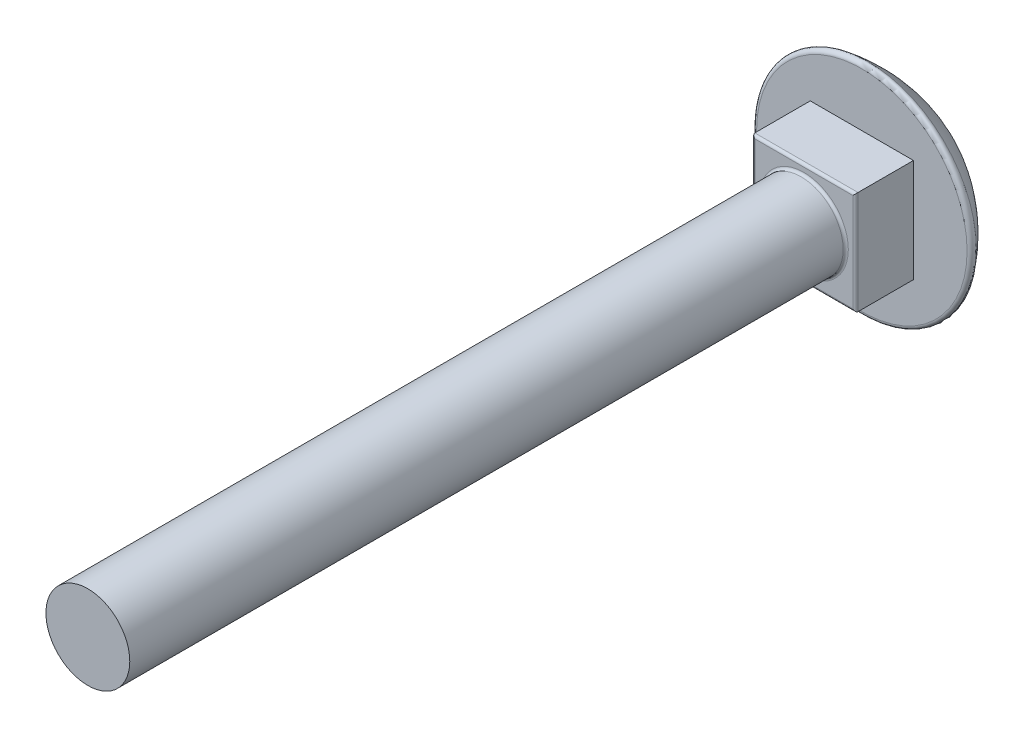
ISO-10303-21;
HEADER;
FILE_DESCRIPTION(('STEP AP214'),'2;1');
FILE_NAME('part.step','',(''),(''),'','','');
FILE_SCHEMA(('AUTOMOTIVE_DESIGN { 1 0 10303 214 1 1 1 1 }'));
ENDSEC;
DATA;
#1=APPLICATION_CONTEXT('core data for automotive mechanical design processes');
#2=APPLICATION_PROTOCOL_DEFINITION('international standard','automotive_design',2000,#1);
#3=PRODUCT_CONTEXT('',#1,'mechanical');
#4=PRODUCT('Part','Part','',(#3));
#5=PRODUCT_RELATED_PRODUCT_CATEGORY('part','',(#4));
#6=PRODUCT_DEFINITION_FORMATION('','',#4);
#7=PRODUCT_DEFINITION_CONTEXT('part definition',#1,'design');
#8=PRODUCT_DEFINITION('design','',#6,#7);
#9=PRODUCT_DEFINITION_SHAPE('','',#8);
#10=(LENGTH_UNIT() NAMED_UNIT(*) SI_UNIT(.MILLI.,.METRE.));
#11=(NAMED_UNIT(*) PLANE_ANGLE_UNIT() SI_UNIT($,.RADIAN.));
#12=(NAMED_UNIT(*) SI_UNIT($,.STERADIAN.) SOLID_ANGLE_UNIT());
#13=UNCERTAINTY_MEASURE_WITH_UNIT(LENGTH_MEASURE(1.E-05),#10,'distance_accuracy_value','');
#14=(GEOMETRIC_REPRESENTATION_CONTEXT(3) GLOBAL_UNCERTAINTY_ASSIGNED_CONTEXT((#13)) GLOBAL_UNIT_ASSIGNED_CONTEXT((#10,
#11,#12)) REPRESENTATION_CONTEXT('',''));
#15=CARTESIAN_POINT('',(0.,0.,0.));
#16=DIRECTION('',(0.,0.,1.));
#17=DIRECTION('',(1.,0.,0.));
#18=AXIS2_PLACEMENT_3D('',#15,#16,#17);
#19=CARTESIAN_POINT('',(0.,0.,0.));
#20=DIRECTION('',(0.,0.,1.));
#21=DIRECTION('',(1.,0.,0.));
#22=AXIS2_PLACEMENT_3D('',#19,#20,#21);
#23=PLANE('',#22);
#24=CARTESIAN_POINT('',(-3.25,0.,0.));
#25=DIRECTION('',(0.,0.,1.));
#26=DIRECTION('',(1.,0.,0.));
#27=AXIS2_PLACEMENT_3D('',#24,#25,#26);
#28=CIRCLE('',#27,3.25);
#29=CARTESIAN_POINT('',(0.,0.,0.));
#30=VERTEX_POINT('',#29);
#31=EDGE_CURVE('E115',#30,#30,#28,.T.);
#32=ORIENTED_EDGE('',*,*,#31,.T.);
#33=EDGE_LOOP('',(#32));
#34=FACE_BOUND('',#33,.T.);
#35=ADVANCED_FACE('F50',(#34),#23,.T.);
#36=CARTESIAN_POINT('',(-3.25,0.,0.));
#37=DIRECTION('',(0.,0.,1.));
#38=DIRECTION('',(1.,0.,0.));
#39=AXIS2_PLACEMENT_3D('',#36,#37,#38);
#40=CYLINDRICAL_SURFACE('',#39,3.25);
#41=CARTESIAN_POINT('',(-3.25,0.,-55.3));
#42=DIRECTION('',(0.,0.,1.));
#43=DIRECTION('',(1.,0.,0.));
#44=AXIS2_PLACEMENT_3D('',#41,#42,#43);
#45=CIRCLE('',#44,3.25);
#46=CARTESIAN_POINT('',(0.,0.,-55.3));
#47=VERTEX_POINT('',#46);
#48=EDGE_CURVE('E179',#47,#47,#45,.T.);
#49=ORIENTED_EDGE('',*,*,#48,.T.);
#50=EDGE_LOOP('',(#49));
#51=FACE_BOUND('',#50,.T.);
#52=ORIENTED_EDGE('',*,*,#31,.F.);
#53=EDGE_LOOP('',(#52));
#54=FACE_BOUND('',#53,.T.);
#55=ADVANCED_FACE('F211',(#51,#54),#40,.T.);
#56=CARTESIAN_POINT('',(0.750000000000001,4.,-55.5));
#57=DIRECTION('',(-1.,0.,0.));
#58=DIRECTION('',(0.,-1.,0.));
#59=AXIS2_PLACEMENT_3D('',#56,#57,#58);
#60=PLANE('',#59);
#61=DIRECTION('',(0.,0.,-1.));
#62=VECTOR('',#61,1.);
#63=CARTESIAN_POINT('',(0.750000000000001,4.,-55.5));
#64=LINE('',#63,#62);
#65=CARTESIAN_POINT('',(0.750000000000001,4.,-55.7));
#66=VERTEX_POINT('',#65);
#67=CARTESIAN_POINT('',(0.750000000000001,4.,-60.));
#68=VERTEX_POINT('',#67);
#69=EDGE_CURVE('E106',#66,#68,#64,.T.);
#70=ORIENTED_EDGE('',*,*,#69,.F.);
#71=DIRECTION('',(0.,1.,0.));
#72=VECTOR('',#71,1.);
#73=CARTESIAN_POINT('',(0.750000000000002,-4.,-55.7));
#74=LINE('',#73,#72);
#75=CARTESIAN_POINT('',(0.750000000000002,-4.,-55.7));
#76=VERTEX_POINT('',#75);
#77=EDGE_CURVE('E176',#66,#76,#74,.F.);
#78=ORIENTED_EDGE('',*,*,#77,.T.);
#79=DIRECTION('',(0.,0.,-1.));
#80=VECTOR('',#79,1.);
#81=CARTESIAN_POINT('',(0.750000000000002,-4.,-55.5));
#82=LINE('',#81,#80);
#83=CARTESIAN_POINT('',(0.750000000000002,-4.,-60.));
#84=VERTEX_POINT('',#83);
#85=EDGE_CURVE('E122',#76,#84,#82,.T.);
#86=ORIENTED_EDGE('',*,*,#85,.T.);
#87=DIRECTION('',(0.,1.,0.));
#88=VECTOR('',#87,1.);
#89=CARTESIAN_POINT('',(0.750000000000001,4.,-60.));
#90=LINE('',#89,#88);
#91=EDGE_CURVE('E119',#84,#68,#90,.T.);
#92=ORIENTED_EDGE('',*,*,#91,.T.);
#93=EDGE_LOOP('',(#70,#78,#86,#92));
#94=FACE_BOUND('',#93,.T.);
#95=ADVANCED_FACE('F120',(#94),#60,.F.);
#96=CARTESIAN_POINT('',(-7.25,4.,-55.5));
#97=DIRECTION('',(0.,-1.,0.));
#98=DIRECTION('',(0.,0.,-1.));
#99=AXIS2_PLACEMENT_3D('',#96,#97,#98);
#100=PLANE('',#99);
#101=DIRECTION('',(0.,0.,-1.));
#102=VECTOR('',#101,1.);
#103=CARTESIAN_POINT('',(-7.25,4.,-55.5));
#104=LINE('',#103,#102);
#105=CARTESIAN_POINT('',(-7.25,4.,-55.7));
#106=VERTEX_POINT('',#105);
#107=CARTESIAN_POINT('',(-7.25,4.,-60.));
#108=VERTEX_POINT('',#107);
#109=EDGE_CURVE('E116',#106,#108,#104,.T.);
#110=ORIENTED_EDGE('',*,*,#109,.F.);
#111=DIRECTION('',(-1.,0.,0.));
#112=VECTOR('',#111,1.);
#113=CARTESIAN_POINT('',(0.750000000000001,4.,-55.7));
#114=LINE('',#113,#112);
#115=EDGE_CURVE('E66',#106,#66,#114,.F.);
#116=ORIENTED_EDGE('',*,*,#115,.T.);
#117=ORIENTED_EDGE('',*,*,#69,.T.);
#118=DIRECTION('',(-1.,0.,0.));
#119=VECTOR('',#118,1.);
#120=CARTESIAN_POINT('',(-7.25,4.,-60.));
#121=LINE('',#120,#119);
#122=EDGE_CURVE('E110',#68,#108,#121,.T.);
#123=ORIENTED_EDGE('',*,*,#122,.T.);
#124=EDGE_LOOP('',(#110,#116,#117,#123));
#125=FACE_BOUND('',#124,.T.);
#126=ADVANCED_FACE('F108',(#125),#100,.F.);
#127=CARTESIAN_POINT('',(-7.25,4.,-55.5));
#128=DIRECTION('',(1.,0.,0.));
#129=DIRECTION('',(0.,1.,0.));
#130=AXIS2_PLACEMENT_3D('',#127,#128,#129);
#131=PLANE('',#130);
#132=DIRECTION('',(0.,0.,-1.));
#133=VECTOR('',#132,1.);
#134=CARTESIAN_POINT('',(-7.25,-4.,-55.5));
#135=LINE('',#134,#133);
#136=CARTESIAN_POINT('',(-7.25,-4.,-55.7));
#137=VERTEX_POINT('',#136);
#138=CARTESIAN_POINT('',(-7.25,-4.,-60.));
#139=VERTEX_POINT('',#138);
#140=EDGE_CURVE('E143',#137,#139,#135,.T.);
#141=ORIENTED_EDGE('',*,*,#140,.F.);
#142=DIRECTION('',(0.,-1.,0.));
#143=VECTOR('',#142,1.);
#144=CARTESIAN_POINT('',(-7.25,4.,-55.7));
#145=LINE('',#144,#143);
#146=EDGE_CURVE('E74',#137,#106,#145,.F.);
#147=ORIENTED_EDGE('',*,*,#146,.T.);
#148=ORIENTED_EDGE('',*,*,#109,.T.);
#149=DIRECTION('',(0.,-1.,0.));
#150=VECTOR('',#149,1.);
#151=CARTESIAN_POINT('',(-7.25,4.,-60.));
#152=LINE('',#151,#150);
#153=EDGE_CURVE('E131',#108,#139,#152,.T.);
#154=ORIENTED_EDGE('',*,*,#153,.T.);
#155=EDGE_LOOP('',(#141,#147,#148,#154));
#156=FACE_BOUND('',#155,.T.);
#157=ADVANCED_FACE('F263',(#156),#131,.F.);
#158=CARTESIAN_POINT('',(-7.25,-4.,-55.5));
#159=DIRECTION('',(0.,1.,0.));
#160=DIRECTION('',(0.,0.,1.));
#161=AXIS2_PLACEMENT_3D('',#158,#159,#160);
#162=PLANE('',#161);
#163=ORIENTED_EDGE('',*,*,#85,.F.);
#164=DIRECTION('',(1.,0.,0.));
#165=VECTOR('',#164,1.);
#166=CARTESIAN_POINT('',(-7.25,-4.,-55.7));
#167=LINE('',#166,#165);
#168=EDGE_CURVE('E168',#76,#137,#167,.F.);
#169=ORIENTED_EDGE('',*,*,#168,.T.);
#170=ORIENTED_EDGE('',*,*,#140,.T.);
#171=DIRECTION('',(1.,0.,0.));
#172=VECTOR('',#171,1.);
#173=CARTESIAN_POINT('',(-7.25,-4.,-60.));
#174=LINE('',#173,#172);
#175=EDGE_CURVE('E136',#139,#84,#174,.T.);
#176=ORIENTED_EDGE('',*,*,#175,.T.);
#177=EDGE_LOOP('',(#163,#169,#170,#176));
#178=FACE_BOUND('',#177,.T.);
#179=ADVANCED_FACE('F246',(#178),#162,.F.);
#180=CARTESIAN_POINT('',(0.,0.,-55.5));
#181=DIRECTION('',(0.,0.,1.));
#182=DIRECTION('',(1.,0.,0.));
#183=AXIS2_PLACEMENT_3D('',#180,#181,#182);
#184=PLANE('',#183);
#185=DIRECTION('',(0.,-1.,0.));
#186=VECTOR('',#185,1.);
#187=CARTESIAN_POINT('',(-7.05,-4.,-55.5));
#188=LINE('',#187,#186);
#189=CARTESIAN_POINT('',(-7.05,3.8,-55.5));
#190=VERTEX_POINT('',#189);
#191=CARTESIAN_POINT('',(-7.05,-3.8,-55.5));
#192=VERTEX_POINT('',#191);
#193=EDGE_CURVE('E161',#190,#192,#188,.T.);
#194=ORIENTED_EDGE('',*,*,#193,.T.);
#195=DIRECTION('',(1.,0.,0.));
#196=VECTOR('',#195,1.);
#197=CARTESIAN_POINT('',(0.750000000000002,-3.8,-55.5));
#198=LINE('',#197,#196);
#199=CARTESIAN_POINT('',(0.550000000000002,-3.8,-55.5));
#200=VERTEX_POINT('',#199);
#201=EDGE_CURVE('E164',#192,#200,#198,.T.);
#202=ORIENTED_EDGE('',*,*,#201,.T.);
#203=DIRECTION('',(0.,1.,0.));
#204=VECTOR('',#203,1.);
#205=CARTESIAN_POINT('',(0.550000000000001,4.,-55.5));
#206=LINE('',#205,#204);
#207=CARTESIAN_POINT('',(0.550000000000001,3.8,-55.5));
#208=VERTEX_POINT('',#207);
#209=EDGE_CURVE('E155',#200,#208,#206,.T.);
#210=ORIENTED_EDGE('',*,*,#209,.T.);
#211=DIRECTION('',(-1.,0.,0.));
#212=VECTOR('',#211,1.);
#213=CARTESIAN_POINT('',(-7.25,3.8,-55.5));
#214=LINE('',#213,#212);
#215=EDGE_CURVE('E158',#208,#190,#214,.T.);
#216=ORIENTED_EDGE('',*,*,#215,.T.);
#217=EDGE_LOOP('',(#194,#202,#210,#216));
#218=FACE_BOUND('',#217,.T.);
#219=CARTESIAN_POINT('',(-3.25,0.,-55.5));
#220=DIRECTION('',(0.,0.,1.));
#221=DIRECTION('',(1.,0.,0.));
#222=AXIS2_PLACEMENT_3D('',#219,#220,#221);
#223=CIRCLE('',#222,3.45);
#224=CARTESIAN_POINT('',(0.2,0.,-55.5));
#225=VERTEX_POINT('',#224);
#226=EDGE_CURVE('E151',#225,#225,#223,.F.);
#227=ORIENTED_EDGE('',*,*,#226,.T.);
#228=EDGE_LOOP('',(#227));
#229=FACE_BOUND('',#228,.T.);
#230=ADVANCED_FACE('F251',(#218,#229),#184,.T.);
#231=CARTESIAN_POINT('',(-4.15344366888914,0.,-53.262723579444));
#232=DIRECTION('',(0.,-1.,0.));
#233=DIRECTION('',(1.,0.,0.));
#234=AXIS2_PLACEMENT_3D('',#231,#232,#233);
#235=CIRCLE('',#234,11.7719950830518);
#236=TRIMMED_CURVE('',#235,(PARAMETER_VALUE(-1.49397562862696)),
(PARAMETER_VALUE(1.49397562862696)),.T.,.PARAMETER.);
#237=CARTESIAN_POINT('',(-3.25,0.,-53.262723579444));
#238=DIRECTION('',(0.,0.,1.));
#239=AXIS1_PLACEMENT('',#237,#238);
#240=SURFACE_OF_REVOLUTION('',#236,#239);
#241=CARTESIAN_POINT('',(-3.25,0.,-60.484029273974));
#242=DIRECTION('',(0.,0.,1.));
#243=DIRECTION('',(1.,0.,0.));
#244=AXIS2_PLACEMENT_3D('',#241,#242,#243);
#245=CIRCLE('',#244,8.39347045901077);
#246=CARTESIAN_POINT('',(5.14347045901077,0.,-60.484029273974));
#247=VERTEX_POINT('',#246);
#248=EDGE_CURVE('E13',#247,#247,#245,.F.);
#249=ORIENTED_EDGE('',*,*,#248,.T.);
#250=EDGE_LOOP('',(#249));
#251=FACE_BOUND('',#250,.T.);
#252=CARTESIAN_POINT('',(-3.25,0.,-65.));
#253=VERTEX_POINT('',#252);
#254=VERTEX_LOOP('',#253);
#255=FACE_BOUND('',#254,.T.);
#256=ADVANCED_FACE('F238',(#251,#255),#240,.T.);
#257=CARTESIAN_POINT('',(0.,0.,-60.));
#258=DIRECTION('',(0.,0.,1.));
#259=DIRECTION('',(1.,0.,0.));
#260=AXIS2_PLACEMENT_3D('',#257,#258,#259);
#261=PLANE('',#260);
#262=CARTESIAN_POINT('',(-3.25,0.,-60.));
#263=DIRECTION('',(0.,0.,1.));
#264=DIRECTION('',(1.,0.,0.));
#265=AXIS2_PLACEMENT_3D('',#262,#263,#264);
#266=CIRCLE('',#265,8.15654594292892);
#267=CARTESIAN_POINT('',(4.90654594292892,0.,-60.));
#268=VERTEX_POINT('',#267);
#269=EDGE_CURVE('E59',#268,#268,#266,.T.);
#270=ORIENTED_EDGE('',*,*,#269,.T.);
#271=EDGE_LOOP('',(#270));
#272=FACE_BOUND('',#271,.T.);
#273=ORIENTED_EDGE('',*,*,#122,.F.);
#274=ORIENTED_EDGE('',*,*,#91,.F.);
#275=ORIENTED_EDGE('',*,*,#175,.F.);
#276=ORIENTED_EDGE('',*,*,#153,.F.);
#277=EDGE_LOOP('',(#273,#274,#275,#276));
#278=FACE_BOUND('',#277,.T.);
#279=ADVANCED_FACE('F129',(#272,#278),#261,.T.);
#280=CARTESIAN_POINT('',(0.,3.8,-55.7));
#281=DIRECTION('',(1.,0.,0.));
#282=DIRECTION('',(0.,0.,-1.));
#283=AXIS2_PLACEMENT_3D('',#280,#281,#282);
#284=CYLINDRICAL_SURFACE('',#283,0.2);
#285=CARTESIAN_POINT('',(0.550000000000001,3.8,-55.7));
#286=DIRECTION('',(0.707106781186548,-0.707106781186547,0.));
#287=DIRECTION('',(-0.707106781186547,-0.707106781186548,0.));
#288=AXIS2_PLACEMENT_3D('',#285,#286,#287);
#289=ELLIPSE('',#288,0.282842712474619,0.2);
#290=EDGE_CURVE('E189',#66,#208,#289,.T.);
#291=ORIENTED_EDGE('',*,*,#290,.F.);
#292=ORIENTED_EDGE('',*,*,#115,.F.);
#293=CARTESIAN_POINT('',(-7.05,3.8,-55.7));
#294=DIRECTION('',(0.707106781186547,0.707106781186548,0.));
#295=DIRECTION('',(0.707106781186548,-0.707106781186547,0.));
#296=AXIS2_PLACEMENT_3D('',#293,#294,#295);
#297=ELLIPSE('',#296,0.282842712474619,0.2);
#298=EDGE_CURVE('E127',#190,#106,#297,.F.);
#299=ORIENTED_EDGE('',*,*,#298,.F.);
#300=ORIENTED_EDGE('',*,*,#215,.F.);
#301=EDGE_LOOP('',(#291,#292,#299,#300));
#302=FACE_BOUND('',#301,.T.);
#303=ADVANCED_FACE('F231',(#302),#284,.T.);
#304=CARTESIAN_POINT('',(-7.05,0.,-55.7));
#305=DIRECTION('',(0.,1.,0.));
#306=DIRECTION('',(-1.,0.,0.));
#307=AXIS2_PLACEMENT_3D('',#304,#305,#306);
#308=CYLINDRICAL_SURFACE('',#307,0.2);
#309=ORIENTED_EDGE('',*,*,#298,.T.);
#310=ORIENTED_EDGE('',*,*,#146,.F.);
#311=CARTESIAN_POINT('',(-7.05,-3.8,-55.7));
#312=DIRECTION('',(-0.707106781186548,0.707106781186547,0.));
#313=DIRECTION('',(0.707106781186547,0.707106781186548,0.));
#314=AXIS2_PLACEMENT_3D('',#311,#312,#313);
#315=ELLIPSE('',#314,0.282842712474619,0.2);
#316=EDGE_CURVE('E186',#192,#137,#315,.F.);
#317=ORIENTED_EDGE('',*,*,#316,.F.);
#318=ORIENTED_EDGE('',*,*,#193,.F.);
#319=EDGE_LOOP('',(#309,#310,#317,#318));
#320=FACE_BOUND('',#319,.T.);
#321=ADVANCED_FACE('F227',(#320),#308,.T.);
#322=CARTESIAN_POINT('',(0.550000000000001,0.,-55.7));
#323=DIRECTION('',(0.,-1.,0.));
#324=DIRECTION('',(1.,0.,0.));
#325=AXIS2_PLACEMENT_3D('',#322,#323,#324);
#326=CYLINDRICAL_SURFACE('',#325,0.2);
#327=ORIENTED_EDGE('',*,*,#290,.T.);
#328=ORIENTED_EDGE('',*,*,#209,.F.);
#329=CARTESIAN_POINT('',(0.550000000000002,-3.8,-55.7));
#330=DIRECTION('',(-0.707106781186547,-0.707106781186548,0.));
#331=DIRECTION('',(0.707106781186548,-0.707106781186547,0.));
#332=AXIS2_PLACEMENT_3D('',#329,#330,#331);
#333=ELLIPSE('',#332,0.282842712474619,0.2);
#334=EDGE_CURVE('E183',#76,#200,#333,.T.);
#335=ORIENTED_EDGE('',*,*,#334,.F.);
#336=ORIENTED_EDGE('',*,*,#77,.F.);
#337=EDGE_LOOP('',(#327,#328,#335,#336));
#338=FACE_BOUND('',#337,.T.);
#339=ADVANCED_FACE('F223',(#338),#326,.T.);
#340=CARTESIAN_POINT('',(0.,-3.8,-55.7));
#341=DIRECTION('',(-1.,0.,0.));
#342=DIRECTION('',(0.,0.,1.));
#343=AXIS2_PLACEMENT_3D('',#340,#341,#342);
#344=CYLINDRICAL_SURFACE('',#343,0.2);
#345=ORIENTED_EDGE('',*,*,#316,.T.);
#346=ORIENTED_EDGE('',*,*,#168,.F.);
#347=ORIENTED_EDGE('',*,*,#334,.T.);
#348=ORIENTED_EDGE('',*,*,#201,.F.);
#349=EDGE_LOOP('',(#345,#346,#347,#348));
#350=FACE_BOUND('',#349,.T.);
#351=ADVANCED_FACE('F207',(#350),#344,.T.);
#352=CARTESIAN_POINT('',(-3.25,0.,-55.3));
#353=DIRECTION('',(0.,0.,1.));
#354=DIRECTION('',(1.,0.,0.));
#355=AXIS2_PLACEMENT_3D('',#352,#353,#354);
#356=TOROIDAL_SURFACE('',#355,3.45,0.2);
#357=ORIENTED_EDGE('',*,*,#48,.F.);
#358=EDGE_LOOP('',(#357));
#359=FACE_BOUND('',#358,.T.);
#360=ORIENTED_EDGE('',*,*,#226,.F.);
#361=EDGE_LOOP('',(#360));
#362=FACE_BOUND('',#361,.T.);
#363=ADVANCED_FACE('F202',(#359,#362),#356,.F.);
#364=CARTESIAN_POINT('',(-3.25,0.,-60.3));
#365=DIRECTION('',(0.,0.,1.));
#366=DIRECTION('',(1.,0.,0.));
#367=AXIS2_PLACEMENT_3D('',#364,#365,#366);
#368=TOROIDAL_SURFACE('',#367,8.15654594292892,0.3);
#369=ORIENTED_EDGE('',*,*,#248,.F.);
#370=EDGE_LOOP('',(#369));
#371=FACE_BOUND('',#370,.T.);
#372=ORIENTED_EDGE('',*,*,#269,.F.);
#373=EDGE_LOOP('',(#372));
#374=FACE_BOUND('',#373,.T.);
#375=ADVANCED_FACE('F52',(#371,#374),#368,.T.);
#376=CLOSED_SHELL('',(#35,#55,#95,#126,#157,#179,#230,#256,#279,#303,#321,#339,#351,#363,#375));
#377=MANIFOLD_SOLID_BREP('B2',#376);
#378=ADVANCED_BREP_SHAPE_REPRESENTATION('',(#18,#377),#14);
#379=SHAPE_DEFINITION_REPRESENTATION(#9,#378);
ENDSEC;
END-ISO-10303-21;
